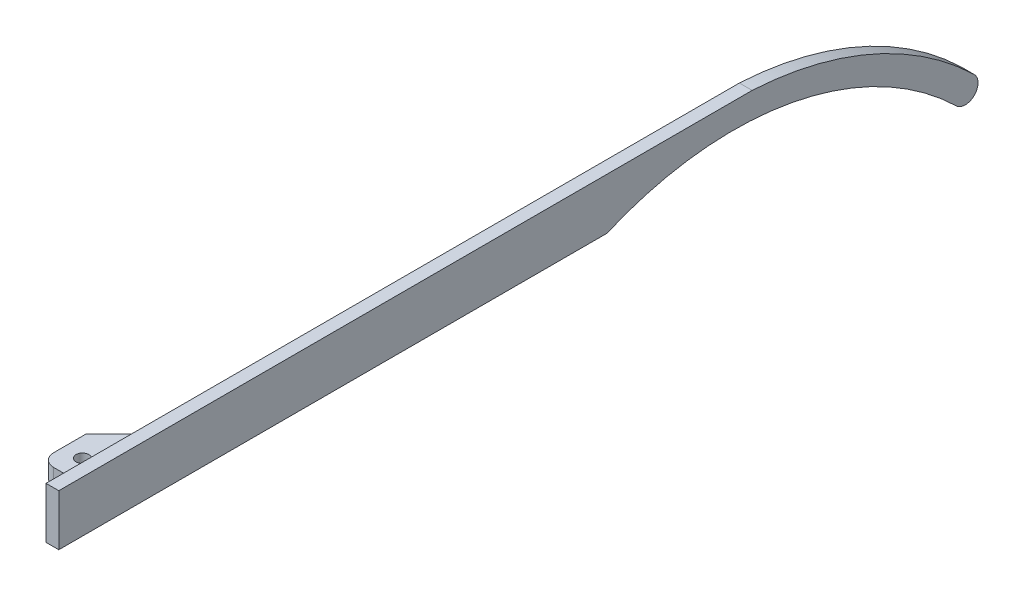
ISO-10303-21;
HEADER;
FILE_DESCRIPTION(('STEP AP214'),'2;1');
FILE_NAME('part.step','',(''),(''),'','','');
FILE_SCHEMA(('AUTOMOTIVE_DESIGN { 1 0 10303 214 1 1 1 1 }'));
ENDSEC;
DATA;
#1=APPLICATION_CONTEXT('core data for automotive mechanical design processes');
#2=APPLICATION_PROTOCOL_DEFINITION('international standard','automotive_design',2000,#1);
#3=PRODUCT_CONTEXT('',#1,'mechanical');
#4=PRODUCT('Part','Part','',(#3));
#5=PRODUCT_RELATED_PRODUCT_CATEGORY('part','',(#4));
#6=PRODUCT_DEFINITION_FORMATION('','',#4);
#7=PRODUCT_DEFINITION_CONTEXT('part definition',#1,'design');
#8=PRODUCT_DEFINITION('design','',#6,#7);
#9=PRODUCT_DEFINITION_SHAPE('','',#8);
#10=(LENGTH_UNIT() NAMED_UNIT(*) SI_UNIT(.MILLI.,.METRE.));
#11=(NAMED_UNIT(*) PLANE_ANGLE_UNIT() SI_UNIT($,.RADIAN.));
#12=(NAMED_UNIT(*) SI_UNIT($,.STERADIAN.) SOLID_ANGLE_UNIT());
#13=UNCERTAINTY_MEASURE_WITH_UNIT(LENGTH_MEASURE(1.E-05),#10,'distance_accuracy_value','');
#14=(GEOMETRIC_REPRESENTATION_CONTEXT(3) GLOBAL_UNCERTAINTY_ASSIGNED_CONTEXT((#13)) GLOBAL_UNIT_ASSIGNED_CONTEXT((#10,
#11,#12)) REPRESENTATION_CONTEXT('',''));
#15=CARTESIAN_POINT('',(0.,0.,0.));
#16=DIRECTION('',(0.,0.,1.));
#17=DIRECTION('',(1.,0.,0.));
#18=AXIS2_PLACEMENT_3D('',#15,#16,#17);
#19=CARTESIAN_POINT('',(-22.,4.,70.));
#20=DIRECTION('',(0.,0.,-1.));
#21=DIRECTION('',(1.,0.,0.));
#22=AXIS2_PLACEMENT_3D('',#19,#20,#21);
#23=PLANE('',#22);
#24=DIRECTION('',(0.,1.,0.));
#25=VECTOR('',#24,1.);
#26=CARTESIAN_POINT('',(-22.,4.,70.));
#27=LINE('',#26,#25);
#28=CARTESIAN_POINT('',(-22.,-1.25,70.));
#29=VERTEX_POINT('',#28);
#30=CARTESIAN_POINT('',(-22.,1.25,70.));
#31=VERTEX_POINT('',#30);
#32=EDGE_CURVE('E135',#29,#31,#27,.T.);
#33=ORIENTED_EDGE('',*,*,#32,.T.);
#34=DIRECTION('',(1.,0.,0.));
#35=VECTOR('',#34,1.);
#36=CARTESIAN_POINT('',(-28.3,1.25,70.));
#37=LINE('',#36,#35);
#38=CARTESIAN_POINT('',(-26.3,1.25,70.));
#39=VERTEX_POINT('',#38);
#40=EDGE_CURVE('E212',#39,#31,#37,.T.);
#41=ORIENTED_EDGE('',*,*,#40,.F.);
#42=DIRECTION('',(0.,-1.,0.));
#43=VECTOR('',#42,1.);
#44=CARTESIAN_POINT('',(-26.3,1.25,70.));
#45=LINE('',#44,#43);
#46=CARTESIAN_POINT('',(-26.3,-1.25,70.));
#47=VERTEX_POINT('',#46);
#48=EDGE_CURVE('E183',#47,#39,#45,.F.);
#49=ORIENTED_EDGE('',*,*,#48,.F.);
#50=DIRECTION('',(1.,0.,0.));
#51=VECTOR('',#50,1.);
#52=CARTESIAN_POINT('',(-28.3,-1.25,70.));
#53=LINE('',#52,#51);
#54=EDGE_CURVE('E153',#47,#29,#53,.T.);
#55=ORIENTED_EDGE('',*,*,#54,.T.);
#56=EDGE_LOOP('',(#33,#41,#49,#55));
#57=FACE_BOUND('',#56,.T.);
#58=ADVANCED_FACE('F35',(#57),#23,.F.);
#59=CARTESIAN_POINT('',(-22.,-4.,70.));
#60=DIRECTION('',(0.,1.,0.));
#61=DIRECTION('',(0.,0.,1.));
#62=AXIS2_PLACEMENT_3D('',#59,#60,#61);
#63=PLANE('',#62);
#64=DIRECTION('',(0.,0.,-1.));
#65=VECTOR('',#64,1.);
#66=CARTESIAN_POINT('',(-20.,-4.,70.));
#67=LINE('',#66,#65);
#68=CARTESIAN_POINT('',(-20.,-4.,75.5));
#69=VERTEX_POINT('',#68);
#70=CARTESIAN_POINT('',(-20.,-4.,-10.2196743943207));
#71=VERTEX_POINT('',#70);
#72=EDGE_CURVE('E128',#69,#71,#67,.T.);
#73=ORIENTED_EDGE('',*,*,#72,.F.);
#74=DIRECTION('',(-1.,0.,0.));
#75=VECTOR('',#74,1.);
#76=CARTESIAN_POINT('',(-20.,-4.,75.5));
#77=LINE('',#76,#75);
#78=CARTESIAN_POINT('',(-22.,-4.,75.5));
#79=VERTEX_POINT('',#78);
#80=EDGE_CURVE('E134',#69,#79,#77,.T.);
#81=ORIENTED_EDGE('',*,*,#80,.T.);
#82=DIRECTION('',(0.,0.,-1.));
#83=VECTOR('',#82,1.);
#84=CARTESIAN_POINT('',(-22.,-4.,70.));
#85=LINE('',#84,#83);
#86=CARTESIAN_POINT('',(-22.,-4.,-10.2196743943207));
#87=VERTEX_POINT('',#86);
#88=EDGE_CURVE('E151',#79,#87,#85,.T.);
#89=ORIENTED_EDGE('',*,*,#88,.T.);
#90=DIRECTION('',(-1.,0.,0.));
#91=VECTOR('',#90,1.);
#92=CARTESIAN_POINT('',(-8.,-4.,-10.2196743943207));
#93=LINE('',#92,#91);
#94=EDGE_CURVE('E147',#71,#87,#93,.T.);
#95=ORIENTED_EDGE('',*,*,#94,.F.);
#96=EDGE_LOOP('',(#73,#81,#89,#95));
#97=FACE_BOUND('',#96,.T.);
#98=ADVANCED_FACE('F145',(#97),#63,.F.);
#99=CARTESIAN_POINT('',(-22.,4.,70.));
#100=DIRECTION('',(0.,-1.,0.));
#101=DIRECTION('',(0.,0.,-1.));
#102=AXIS2_PLACEMENT_3D('',#99,#100,#101);
#103=PLANE('',#102);
#104=DIRECTION('',(0.,0.,1.));
#105=VECTOR('',#104,1.);
#106=CARTESIAN_POINT('',(-22.,4.,70.));
#107=LINE('',#106,#105);
#108=CARTESIAN_POINT('',(-22.,4.,-32.9197941374121));
#109=VERTEX_POINT('',#108);
#110=CARTESIAN_POINT('',(-22.,4.,75.5));
#111=VERTEX_POINT('',#110);
#112=EDGE_CURVE('E148',#109,#111,#107,.T.);
#113=ORIENTED_EDGE('',*,*,#112,.T.);
#114=DIRECTION('',(1.,0.,0.));
#115=VECTOR('',#114,1.);
#116=CARTESIAN_POINT('',(-20.,4.,75.5));
#117=LINE('',#116,#115);
#118=CARTESIAN_POINT('',(-20.,4.,75.5));
#119=VERTEX_POINT('',#118);
#120=EDGE_CURVE('E179',#111,#119,#117,.T.);
#121=ORIENTED_EDGE('',*,*,#120,.T.);
#122=DIRECTION('',(0.,0.,1.));
#123=VECTOR('',#122,1.);
#124=CARTESIAN_POINT('',(-20.,4.,70.));
#125=LINE('',#124,#123);
#126=CARTESIAN_POINT('',(-20.,4.,-32.9197941374121));
#127=VERTEX_POINT('',#126);
#128=EDGE_CURVE('E130',#127,#119,#125,.T.);
#129=ORIENTED_EDGE('',*,*,#128,.F.);
#130=DIRECTION('',(-1.,0.,0.));
#131=VECTOR('',#130,1.);
#132=CARTESIAN_POINT('',(-20.,4.,-32.9197941374121));
#133=LINE('',#132,#131);
#134=EDGE_CURVE('E178',#109,#127,#133,.F.);
#135=ORIENTED_EDGE('',*,*,#134,.F.);
#136=EDGE_LOOP('',(#113,#121,#129,#135));
#137=FACE_BOUND('',#136,.T.);
#138=ADVANCED_FACE('F256',(#137),#103,.F.);
#139=CARTESIAN_POINT('',(-22.,0.,0.));
#140=DIRECTION('',(-1.,0.,0.));
#141=DIRECTION('',(0.,0.,-1.));
#142=AXIS2_PLACEMENT_3D('',#139,#140,#141);
#143=PLANE('',#142);
#144=DIRECTION('',(0.,0.,1.));
#145=VECTOR('',#144,1.);
#146=CARTESIAN_POINT('',(-22.,1.25,70.));
#147=LINE('',#146,#145);
#148=CARTESIAN_POINT('',(-22.,1.25,56.7));
#149=VERTEX_POINT('',#148);
#150=EDGE_CURVE('E200',#149,#31,#147,.T.);
#151=ORIENTED_EDGE('',*,*,#150,.T.);
#152=ORIENTED_EDGE('',*,*,#32,.F.);
#153=DIRECTION('',(0.,0.,-1.));
#154=VECTOR('',#153,1.);
#155=CARTESIAN_POINT('',(-22.,-1.25,70.));
#156=LINE('',#155,#154);
#157=CARTESIAN_POINT('',(-22.,-1.25,56.7));
#158=VERTEX_POINT('',#157);
#159=EDGE_CURVE('E194',#29,#158,#156,.T.);
#160=ORIENTED_EDGE('',*,*,#159,.T.);
#161=DIRECTION('',(0.,-1.,0.));
#162=VECTOR('',#161,1.);
#163=CARTESIAN_POINT('',(-22.,0.,56.7));
#164=LINE('',#163,#162);
#165=EDGE_CURVE('E189',#149,#158,#164,.T.);
#166=ORIENTED_EDGE('',*,*,#165,.F.);
#167=EDGE_LOOP('',(#151,#152,#160,#166));
#168=FACE_BOUND('',#167,.T.);
#169=CARTESIAN_POINT('',(-22.,-49.9210052038641,-30.));
#170=DIRECTION('',(1.,0.,0.));
#171=DIRECTION('',(0.,0.,-1.));
#172=AXIS2_PLACEMENT_3D('',#169,#170,#171);
#173=CIRCLE('',#172,50.);
#174=CARTESIAN_POINT('',(-22.,-14.0616308893846,-64.8440134567482));
#175=VERTEX_POINT('',#174);
#176=EDGE_CURVE('E218',#175,#87,#173,.T.);
#177=ORIENTED_EDGE('',*,*,#176,.T.);
#178=ORIENTED_EDGE('',*,*,#88,.F.);
#179=DIRECTION('',(0.,1.,0.));
#180=VECTOR('',#179,1.);
#181=CARTESIAN_POINT('',(-22.,4.,75.5));
#182=LINE('',#181,#180);
#183=EDGE_CURVE('E139',#79,#111,#182,.T.);
#184=ORIENTED_EDGE('',*,*,#183,.T.);
#185=ORIENTED_EDGE('',*,*,#112,.F.);
#186=CARTESIAN_POINT('',(-22.,-49.9210052038641,-30.));
#187=DIRECTION('',(1.,0.,0.));
#188=DIRECTION('',(0.,0.,-1.));
#189=AXIS2_PLACEMENT_3D('',#186,#187,#188);
#190=CIRCLE('',#189,54.);
#191=CARTESIAN_POINT('',(-22.,-11.1928809442262,-67.631534533288));
#192=VERTEX_POINT('',#191);
#193=EDGE_CURVE('E249',#192,#109,#190,.T.);
#194=ORIENTED_EDGE('',*,*,#193,.F.);
#195=CARTESIAN_POINT('',(-22.,-12.6272559168054,-66.2377739950181));
#196=DIRECTION('',(1.,0.,0.));
#197=DIRECTION('',(0.,0.,-1.));
#198=AXIS2_PLACEMENT_3D('',#195,#196,#197);
#199=CIRCLE('',#198,2.);
#200=CARTESIAN_POINT('',(-22.,-14.0751534537515,-67.6174814721687));
#201=VERTEX_POINT('',#200);
#202=EDGE_CURVE('E161',#201,#192,#199,.T.);
#203=ORIENTED_EDGE('',*,*,#202,.F.);
#204=CARTESIAN_POINT('',(-22.,-12.6272559168054,-66.2377739950181));
#205=DIRECTION('',(1.,0.,0.));
#206=DIRECTION('',(0.,0.,-1.));
#207=AXIS2_PLACEMENT_3D('',#204,#205,#206);
#208=CIRCLE('',#207,2.);
#209=EDGE_CURVE('E164',#175,#201,#208,.T.);
#210=ORIENTED_EDGE('',*,*,#209,.F.);
#211=EDGE_LOOP('',(#177,#178,#184,#185,#194,#203,#210));
#212=FACE_BOUND('',#211,.T.);
#213=ADVANCED_FACE('F195',(#168,#212),#143,.T.);
#214=CARTESIAN_POINT('',(-20.,0.,0.));
#215=DIRECTION('',(-1.,0.,0.));
#216=DIRECTION('',(0.,0.,-1.));
#217=AXIS2_PLACEMENT_3D('',#214,#215,#216);
#218=PLANE('',#217);
#219=CARTESIAN_POINT('',(-20.,-12.6272559168054,-66.2377739950181));
#220=DIRECTION('',(1.,0.,0.));
#221=DIRECTION('',(0.,0.,-1.));
#222=AXIS2_PLACEMENT_3D('',#219,#220,#221);
#223=CIRCLE('',#222,2.);
#224=CARTESIAN_POINT('',(-20.,-11.1928809442262,-67.631534533288));
#225=VERTEX_POINT('',#224);
#226=CARTESIAN_POINT('',(-20.,-14.0751534537515,-67.6174814721687));
#227=VERTEX_POINT('',#226);
#228=EDGE_CURVE('E167',#225,#227,#223,.F.);
#229=ORIENTED_EDGE('',*,*,#228,.F.);
#230=CARTESIAN_POINT('',(-20.,-49.9210052038641,-30.));
#231=DIRECTION('',(1.,0.,0.));
#232=DIRECTION('',(0.,0.,-1.));
#233=AXIS2_PLACEMENT_3D('',#230,#231,#232);
#234=CIRCLE('',#233,54.);
#235=EDGE_CURVE('E221',#225,#127,#234,.T.);
#236=ORIENTED_EDGE('',*,*,#235,.T.);
#237=ORIENTED_EDGE('',*,*,#128,.T.);
#238=DIRECTION('',(0.,-1.,0.));
#239=VECTOR('',#238,1.);
#240=CARTESIAN_POINT('',(-20.,4.,75.5));
#241=LINE('',#240,#239);
#242=EDGE_CURVE('E122',#119,#69,#241,.T.);
#243=ORIENTED_EDGE('',*,*,#242,.T.);
#244=ORIENTED_EDGE('',*,*,#72,.T.);
#245=CARTESIAN_POINT('',(-20.,-49.9210052038641,-30.));
#246=DIRECTION('',(1.,0.,0.));
#247=DIRECTION('',(0.,0.,-1.));
#248=AXIS2_PLACEMENT_3D('',#245,#246,#247);
#249=CIRCLE('',#248,50.);
#250=CARTESIAN_POINT('',(-20.,-14.0616308893846,-64.8440134567482));
#251=VERTEX_POINT('',#250);
#252=EDGE_CURVE('E157',#251,#71,#249,.T.);
#253=ORIENTED_EDGE('',*,*,#252,.F.);
#254=CARTESIAN_POINT('',(-20.,-12.6272559168054,-66.2377739950181));
#255=DIRECTION('',(1.,0.,0.));
#256=DIRECTION('',(0.,0.,-1.));
#257=AXIS2_PLACEMENT_3D('',#254,#255,#256);
#258=CIRCLE('',#257,2.);
#259=EDGE_CURVE('E170',#227,#251,#258,.F.);
#260=ORIENTED_EDGE('',*,*,#259,.F.);
#261=EDGE_LOOP('',(#229,#236,#237,#243,#244,#253,#260));
#262=FACE_BOUND('',#261,.T.);
#263=ADVANCED_FACE('F125',(#262),#218,.F.);
#264=CARTESIAN_POINT('',(-28.3,-1.25,70.));
#265=DIRECTION('',(0.,1.,0.));
#266=DIRECTION('',(0.,0.,1.));
#267=AXIS2_PLACEMENT_3D('',#264,#265,#266);
#268=PLANE('',#267);
#269=CARTESIAN_POINT('',(-25.3,-1.25,66.5));
#270=DIRECTION('',(0.,-1.,0.));
#271=DIRECTION('',(0.,0.,1.));
#272=AXIS2_PLACEMENT_3D('',#269,#270,#271);
#273=CIRCLE('',#272,1.);
#274=CARTESIAN_POINT('',(-25.3,-1.25,67.5));
#275=VERTEX_POINT('',#274);
#276=EDGE_CURVE('E201',#275,#275,#273,.T.);
#277=ORIENTED_EDGE('',*,*,#276,.F.);
#278=EDGE_LOOP('',(#277));
#279=FACE_BOUND('',#278,.T.);
#280=DIRECTION('',(0.,0.,-1.));
#281=VECTOR('',#280,1.);
#282=CARTESIAN_POINT('',(-28.3,-1.25,70.));
#283=LINE('',#282,#281);
#284=CARTESIAN_POINT('',(-28.3,-1.25,68.));
#285=VERTEX_POINT('',#284);
#286=CARTESIAN_POINT('',(-28.3,-1.25,63.));
#287=VERTEX_POINT('',#286);
#288=EDGE_CURVE('E203',#285,#287,#283,.T.);
#289=ORIENTED_EDGE('',*,*,#288,.T.);
#290=DIRECTION('',(-0.707106781186551,0.,0.707106781186544));
#291=VECTOR('',#290,1.);
#292=CARTESIAN_POINT('',(-31.8,-1.25,66.5));
#293=LINE('',#292,#291);
#294=EDGE_CURVE('E11',#158,#287,#293,.T.);
#295=ORIENTED_EDGE('',*,*,#294,.F.);
#296=ORIENTED_EDGE('',*,*,#159,.F.);
#297=ORIENTED_EDGE('',*,*,#54,.F.);
#298=CARTESIAN_POINT('',(-26.3,-1.25,68.));
#299=DIRECTION('',(0.,-1.,0.));
#300=DIRECTION('',(0.,0.,1.));
#301=AXIS2_PLACEMENT_3D('',#298,#299,#300);
#302=CIRCLE('',#301,2.);
#303=EDGE_CURVE('E181',#285,#47,#302,.F.);
#304=ORIENTED_EDGE('',*,*,#303,.F.);
#305=EDGE_LOOP('',(#289,#295,#296,#297,#304));
#306=FACE_BOUND('',#305,.T.);
#307=ADVANCED_FACE('F272',(#279,#306),#268,.F.);
#308=CARTESIAN_POINT('',(-28.3,1.25,70.));
#309=DIRECTION('',(0.,-1.,0.));
#310=DIRECTION('',(0.,0.,-1.));
#311=AXIS2_PLACEMENT_3D('',#308,#309,#310);
#312=PLANE('',#311);
#313=CARTESIAN_POINT('',(-25.3,1.25,66.5));
#314=DIRECTION('',(0.,-1.,0.));
#315=DIRECTION('',(0.,0.,1.));
#316=AXIS2_PLACEMENT_3D('',#313,#314,#315);
#317=CIRCLE('',#316,1.);
#318=CARTESIAN_POINT('',(-25.3,1.25,67.5));
#319=VERTEX_POINT('',#318);
#320=EDGE_CURVE('E206',#319,#319,#317,.T.);
#321=ORIENTED_EDGE('',*,*,#320,.T.);
#322=EDGE_LOOP('',(#321));
#323=FACE_BOUND('',#322,.T.);
#324=ORIENTED_EDGE('',*,*,#40,.T.);
#325=ORIENTED_EDGE('',*,*,#150,.F.);
#326=DIRECTION('',(0.707106781186551,0.,-0.707106781186544));
#327=VECTOR('',#326,1.);
#328=CARTESIAN_POINT('',(-31.8,1.25,66.5));
#329=LINE('',#328,#327);
#330=CARTESIAN_POINT('',(-28.3,1.25,63.));
#331=VERTEX_POINT('',#330);
#332=EDGE_CURVE('E43',#331,#149,#329,.T.);
#333=ORIENTED_EDGE('',*,*,#332,.F.);
#334=DIRECTION('',(0.,0.,1.));
#335=VECTOR('',#334,1.);
#336=CARTESIAN_POINT('',(-28.3,1.25,70.));
#337=LINE('',#336,#335);
#338=CARTESIAN_POINT('',(-28.3,1.25,68.));
#339=VERTEX_POINT('',#338);
#340=EDGE_CURVE('E209',#331,#339,#337,.T.);
#341=ORIENTED_EDGE('',*,*,#340,.T.);
#342=CARTESIAN_POINT('',(-26.3,1.25,68.));
#343=DIRECTION('',(0.,1.,0.));
#344=DIRECTION('',(0.,0.,-1.));
#345=AXIS2_PLACEMENT_3D('',#342,#343,#344);
#346=CIRCLE('',#345,2.);
#347=EDGE_CURVE('E186',#39,#339,#346,.F.);
#348=ORIENTED_EDGE('',*,*,#347,.F.);
#349=EDGE_LOOP('',(#324,#325,#333,#341,#348));
#350=FACE_BOUND('',#349,.T.);
#351=ADVANCED_FACE('F233',(#323,#350),#312,.F.);
#352=CARTESIAN_POINT('',(-28.3,0.,0.));
#353=DIRECTION('',(-1.,0.,0.));
#354=DIRECTION('',(0.,0.,-1.));
#355=AXIS2_PLACEMENT_3D('',#352,#353,#354);
#356=PLANE('',#355);
#357=ORIENTED_EDGE('',*,*,#340,.F.);
#358=DIRECTION('',(0.,1.,0.));
#359=VECTOR('',#358,1.);
#360=CARTESIAN_POINT('',(-28.3,1.25,63.));
#361=LINE('',#360,#359);
#362=EDGE_CURVE('E229',#287,#331,#361,.T.);
#363=ORIENTED_EDGE('',*,*,#362,.F.);
#364=ORIENTED_EDGE('',*,*,#288,.F.);
#365=DIRECTION('',(0.,-1.,0.));
#366=VECTOR('',#365,1.);
#367=CARTESIAN_POINT('',(-28.3,-1.25,68.));
#368=LINE('',#367,#366);
#369=EDGE_CURVE('E175',#339,#285,#368,.T.);
#370=ORIENTED_EDGE('',*,*,#369,.F.);
#371=EDGE_LOOP('',(#357,#363,#364,#370));
#372=FACE_BOUND('',#371,.T.);
#373=ADVANCED_FACE('F235',(#372),#356,.T.);
#374=CARTESIAN_POINT('',(-25.3,-2.75,66.5));
#375=DIRECTION('',(0.,1.,0.));
#376=DIRECTION('',(0.,0.,1.));
#377=AXIS2_PLACEMENT_3D('',#374,#375,#376);
#378=CYLINDRICAL_SURFACE('',#377,1.);
#379=ORIENTED_EDGE('',*,*,#320,.F.);
#380=EDGE_LOOP('',(#379));
#381=FACE_BOUND('',#380,.T.);
#382=ORIENTED_EDGE('',*,*,#276,.T.);
#383=EDGE_LOOP('',(#382));
#384=FACE_BOUND('',#383,.T.);
#385=ADVANCED_FACE('F282',(#381,#384),#378,.F.);
#386=CARTESIAN_POINT('',(-8.,-49.9210052038641,-30.));
#387=DIRECTION('',(-1.,0.,0.));
#388=DIRECTION('',(0.,0.,-1.));
#389=AXIS2_PLACEMENT_3D('',#386,#387,#388);
#390=CYLINDRICAL_SURFACE('',#389,50.);
#391=ORIENTED_EDGE('',*,*,#252,.T.);
#392=ORIENTED_EDGE('',*,*,#94,.T.);
#393=ORIENTED_EDGE('',*,*,#176,.F.);
#394=DIRECTION('',(-1.,0.,0.));
#395=VECTOR('',#394,1.);
#396=CARTESIAN_POINT('',(-8.,-14.0616308893846,-64.8440134567482));
#397=LINE('',#396,#395);
#398=EDGE_CURVE('E159',#251,#175,#397,.T.);
#399=ORIENTED_EDGE('',*,*,#398,.F.);
#400=EDGE_LOOP('',(#391,#392,#393,#399));
#401=FACE_BOUND('',#400,.T.);
#402=ADVANCED_FACE('F223',(#401),#390,.F.);
#403=CARTESIAN_POINT('',(-20.,-49.9210052038641,-30.));
#404=DIRECTION('',(-1.,0.,0.));
#405=DIRECTION('',(0.,0.,-1.));
#406=AXIS2_PLACEMENT_3D('',#403,#404,#405);
#407=CYLINDRICAL_SURFACE('',#406,54.);
#408=ORIENTED_EDGE('',*,*,#193,.T.);
#409=ORIENTED_EDGE('',*,*,#134,.T.);
#410=ORIENTED_EDGE('',*,*,#235,.F.);
#411=DIRECTION('',(-1.,0.,0.));
#412=VECTOR('',#411,1.);
#413=CARTESIAN_POINT('',(-20.,-11.1928809442262,-67.631534533288));
#414=LINE('',#413,#412);
#415=EDGE_CURVE('E173',#192,#225,#414,.F.);
#416=ORIENTED_EDGE('',*,*,#415,.F.);
#417=EDGE_LOOP('',(#408,#409,#410,#416));
#418=FACE_BOUND('',#417,.T.);
#419=ADVANCED_FACE('F253',(#418),#407,.T.);
#420=CARTESIAN_POINT('',(-20.,-12.6272559168054,-66.2377739950181));
#421=DIRECTION('',(-1.,0.,0.));
#422=DIRECTION('',(0.,0.,-1.));
#423=AXIS2_PLACEMENT_3D('',#420,#421,#422);
#424=CYLINDRICAL_SURFACE('',#423,2.);
#425=DIRECTION('',(-1.,0.,0.));
#426=VECTOR('',#425,1.);
#427=CARTESIAN_POINT('',(-20.,-14.0751534537515,-67.6174814721687));
#428=LINE('',#427,#426);
#429=EDGE_CURVE('E176',#227,#201,#428,.T.);
#430=ORIENTED_EDGE('',*,*,#429,.T.);
#431=ORIENTED_EDGE('',*,*,#202,.T.);
#432=ORIENTED_EDGE('',*,*,#415,.T.);
#433=ORIENTED_EDGE('',*,*,#228,.T.);
#434=EDGE_LOOP('',(#430,#431,#432,#433));
#435=FACE_BOUND('',#434,.T.);
#436=ADVANCED_FACE('F290',(#435),#424,.T.);
#437=CARTESIAN_POINT('',(-8.,-12.6272559168054,-66.2377739950181));
#438=DIRECTION('',(-1.,0.,0.));
#439=DIRECTION('',(0.,0.,-1.));
#440=AXIS2_PLACEMENT_3D('',#437,#438,#439);
#441=CYLINDRICAL_SURFACE('',#440,2.);
#442=ORIENTED_EDGE('',*,*,#259,.T.);
#443=ORIENTED_EDGE('',*,*,#398,.T.);
#444=ORIENTED_EDGE('',*,*,#209,.T.);
#445=ORIENTED_EDGE('',*,*,#429,.F.);
#446=EDGE_LOOP('',(#442,#443,#444,#445));
#447=FACE_BOUND('',#446,.T.);
#448=ADVANCED_FACE('F296',(#447),#441,.T.);
#449=CARTESIAN_POINT('',(-26.3,0.,68.));
#450=DIRECTION('',(0.,1.,0.));
#451=DIRECTION('',(0.,0.,1.));
#452=AXIS2_PLACEMENT_3D('',#449,#450,#451);
#453=CYLINDRICAL_SURFACE('',#452,2.);
#454=ORIENTED_EDGE('',*,*,#347,.T.);
#455=ORIENTED_EDGE('',*,*,#369,.T.);
#456=ORIENTED_EDGE('',*,*,#303,.T.);
#457=ORIENTED_EDGE('',*,*,#48,.T.);
#458=EDGE_LOOP('',(#454,#455,#456,#457));
#459=FACE_BOUND('',#458,.T.);
#460=ADVANCED_FACE('F239',(#459),#453,.T.);
#461=CARTESIAN_POINT('',(-20.,0.,75.5));
#462=DIRECTION('',(0.,0.,1.));
#463=DIRECTION('',(-1.,0.,0.));
#464=AXIS2_PLACEMENT_3D('',#461,#462,#463);
#465=PLANE('',#464);
#466=ORIENTED_EDGE('',*,*,#242,.F.);
#467=ORIENTED_EDGE('',*,*,#120,.F.);
#468=ORIENTED_EDGE('',*,*,#183,.F.);
#469=ORIENTED_EDGE('',*,*,#80,.F.);
#470=EDGE_LOOP('',(#466,#467,#468,#469));
#471=FACE_BOUND('',#470,.T.);
#472=ADVANCED_FACE('F138',(#471),#465,.T.);
#473=CARTESIAN_POINT('',(-28.3,1.25,63.));
#474=DIRECTION('',(0.707106781186544,0.,0.707106781186551));
#475=DIRECTION('',(0.,1.,0.));
#476=AXIS2_PLACEMENT_3D('',#473,#474,#475);
#477=PLANE('',#476);
#478=ORIENTED_EDGE('',*,*,#294,.T.);
#479=ORIENTED_EDGE('',*,*,#362,.T.);
#480=ORIENTED_EDGE('',*,*,#332,.T.);
#481=ORIENTED_EDGE('',*,*,#165,.T.);
#482=EDGE_LOOP('',(#478,#479,#480,#481));
#483=FACE_BOUND('',#482,.T.);
#484=ADVANCED_FACE('F37',(#483),#477,.F.);
#485=CLOSED_SHELL('',(#58,#98,#138,#213,#263,#307,#351,#373,#385,#402,#419,#436,#448,#460,#472,#484));
#486=MANIFOLD_SOLID_BREP('B2',#485);
#487=ADVANCED_BREP_SHAPE_REPRESENTATION('',(#18,#486),#14);
#488=SHAPE_DEFINITION_REPRESENTATION(#9,#487);
ENDSEC;
END-ISO-10303-21;
